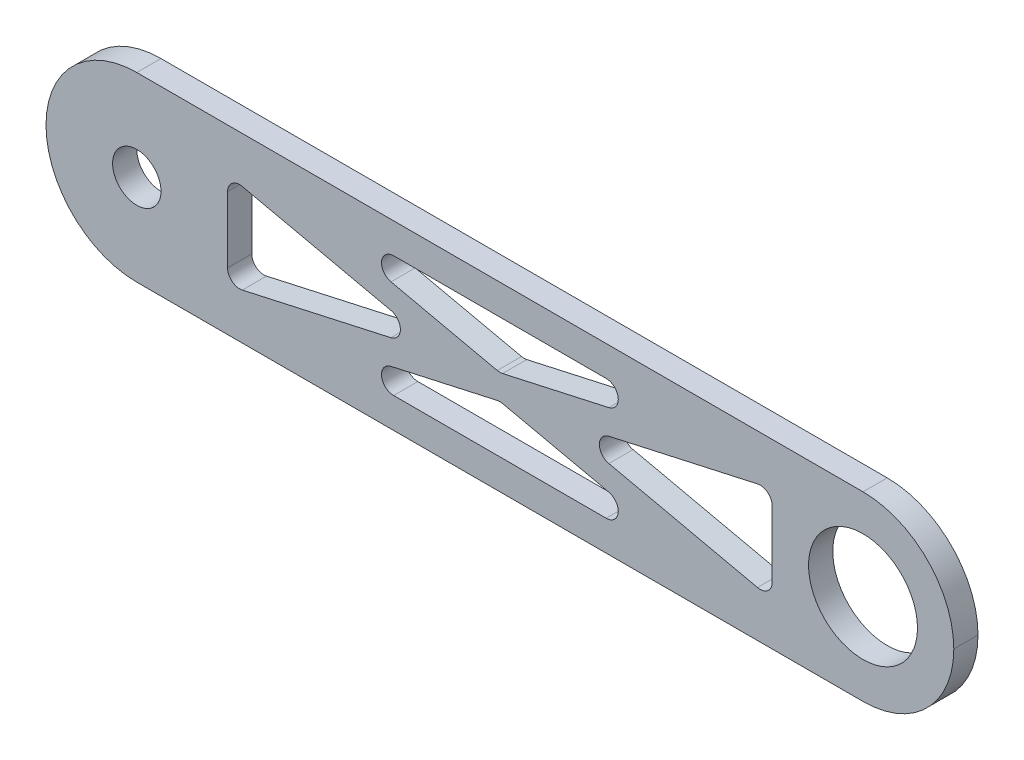
ISO-10303-21;
HEADER;
FILE_DESCRIPTION(('STEP AP214'),'2;1');
FILE_NAME('part.step','',(''),(''),'','','');
FILE_SCHEMA(('AUTOMOTIVE_DESIGN { 1 0 10303 214 1 1 1 1 }'));
ENDSEC;
DATA;
#1=APPLICATION_CONTEXT('core data for automotive mechanical design processes');
#2=APPLICATION_PROTOCOL_DEFINITION('international standard','automotive_design',2000,#1);
#3=PRODUCT_CONTEXT('',#1,'mechanical');
#4=PRODUCT('Part','Part','',(#3));
#5=PRODUCT_RELATED_PRODUCT_CATEGORY('part','',(#4));
#6=PRODUCT_DEFINITION_FORMATION('','',#4);
#7=PRODUCT_DEFINITION_CONTEXT('part definition',#1,'design');
#8=PRODUCT_DEFINITION('design','',#6,#7);
#9=PRODUCT_DEFINITION_SHAPE('','',#8);
#10=(LENGTH_UNIT() NAMED_UNIT(*) SI_UNIT(.MILLI.,.METRE.));
#11=(NAMED_UNIT(*) PLANE_ANGLE_UNIT() SI_UNIT($,.RADIAN.));
#12=(NAMED_UNIT(*) SI_UNIT($,.STERADIAN.) SOLID_ANGLE_UNIT());
#13=UNCERTAINTY_MEASURE_WITH_UNIT(LENGTH_MEASURE(1.E-05),#10,'distance_accuracy_value','');
#14=(GEOMETRIC_REPRESENTATION_CONTEXT(3) GLOBAL_UNCERTAINTY_ASSIGNED_CONTEXT((#13)) GLOBAL_UNIT_ASSIGNED_CONTEXT((#10,
#11,#12)) REPRESENTATION_CONTEXT('',''));
#15=CARTESIAN_POINT('',(0.,0.,0.));
#16=DIRECTION('',(0.,0.,1.));
#17=DIRECTION('',(1.,0.,0.));
#18=AXIS2_PLACEMENT_3D('',#15,#16,#17);
#19=CARTESIAN_POINT('',(-37.5,7.5,2.));
#20=DIRECTION('',(0.,-1.,0.));
#21=DIRECTION('',(0.,0.,-1.));
#22=AXIS2_PLACEMENT_3D('',#19,#20,#21);
#23=PLANE('',#22);
#24=DIRECTION('',(-1.,0.,0.));
#25=VECTOR('',#24,1.);
#26=CARTESIAN_POINT('',(-37.5,7.5,0.));
#27=LINE('',#26,#25);
#28=CARTESIAN_POINT('',(30.,7.5,0.));
#29=VERTEX_POINT('',#28);
#30=CARTESIAN_POINT('',(-30.,7.5,0.));
#31=VERTEX_POINT('',#30);
#32=EDGE_CURVE('E239',#29,#31,#27,.T.);
#33=ORIENTED_EDGE('',*,*,#32,.T.);
#34=DIRECTION('',(0.,0.,-1.));
#35=VECTOR('',#34,1.);
#36=CARTESIAN_POINT('',(-30.,7.5,2.));
#37=LINE('',#36,#35);
#38=CARTESIAN_POINT('',(-30.,7.5,2.));
#39=VERTEX_POINT('',#38);
#40=EDGE_CURVE('E276',#31,#39,#37,.F.);
#41=ORIENTED_EDGE('',*,*,#40,.T.);
#42=DIRECTION('',(-1.,0.,0.));
#43=VECTOR('',#42,1.);
#44=CARTESIAN_POINT('',(-37.5,7.5,2.));
#45=LINE('',#44,#43);
#46=CARTESIAN_POINT('',(30.,7.5,2.));
#47=VERTEX_POINT('',#46);
#48=EDGE_CURVE('E569',#47,#39,#45,.T.);
#49=ORIENTED_EDGE('',*,*,#48,.F.);
#50=DIRECTION('',(0.,0.,-1.));
#51=VECTOR('',#50,1.);
#52=CARTESIAN_POINT('',(30.,7.5,2.));
#53=LINE('',#52,#51);
#54=EDGE_CURVE('E274',#47,#29,#53,.T.);
#55=ORIENTED_EDGE('',*,*,#54,.T.);
#56=EDGE_LOOP('',(#33,#41,#49,#55));
#57=FACE_BOUND('',#56,.T.);
#58=ADVANCED_FACE('F34',(#57),#23,.F.);
#59=CARTESIAN_POINT('',(-37.5,-7.5,2.));
#60=DIRECTION('',(0.,1.,0.));
#61=DIRECTION('',(0.,0.,1.));
#62=AXIS2_PLACEMENT_3D('',#59,#60,#61);
#63=PLANE('',#62);
#64=DIRECTION('',(1.,0.,0.));
#65=VECTOR('',#64,1.);
#66=CARTESIAN_POINT('',(-37.5,-7.5,0.));
#67=LINE('',#66,#65);
#68=CARTESIAN_POINT('',(-30.,-7.5,0.));
#69=VERTEX_POINT('',#68);
#70=CARTESIAN_POINT('',(30.,-7.5,0.));
#71=VERTEX_POINT('',#70);
#72=EDGE_CURVE('E572',#69,#71,#67,.T.);
#73=ORIENTED_EDGE('',*,*,#72,.T.);
#74=DIRECTION('',(0.,0.,-1.));
#75=VECTOR('',#74,1.);
#76=CARTESIAN_POINT('',(30.,-7.5,2.));
#77=LINE('',#76,#75);
#78=CARTESIAN_POINT('',(30.,-7.5,2.));
#79=VERTEX_POINT('',#78);
#80=EDGE_CURVE('E255',#71,#79,#77,.F.);
#81=ORIENTED_EDGE('',*,*,#80,.T.);
#82=DIRECTION('',(1.,0.,0.));
#83=VECTOR('',#82,1.);
#84=CARTESIAN_POINT('',(-37.5,-7.5,2.));
#85=LINE('',#84,#83);
#86=CARTESIAN_POINT('',(-30.,-7.5,2.));
#87=VERTEX_POINT('',#86);
#88=EDGE_CURVE('E242',#87,#79,#85,.T.);
#89=ORIENTED_EDGE('',*,*,#88,.F.);
#90=DIRECTION('',(0.,0.,-1.));
#91=VECTOR('',#90,1.);
#92=CARTESIAN_POINT('',(-30.,-7.5,2.));
#93=LINE('',#92,#91);
#94=EDGE_CURVE('E263',#87,#69,#93,.T.);
#95=ORIENTED_EDGE('',*,*,#94,.T.);
#96=EDGE_LOOP('',(#73,#81,#89,#95));
#97=FACE_BOUND('',#96,.T.);
#98=ADVANCED_FACE('F439',(#97),#63,.F.);
#99=CARTESIAN_POINT('',(0.,0.,2.));
#100=DIRECTION('',(0.,0.,-1.));
#101=DIRECTION('',(-1.,0.,0.));
#102=AXIS2_PLACEMENT_3D('',#99,#100,#101);
#103=PLANE('',#102);
#104=DIRECTION('',(0.976187060183953,-0.216930457818656,0.));
#105=VECTOR('',#104,1.);
#106=CARTESIAN_POINT('',(4.60977222864645,0.,2.));
#107=LINE('',#106,#105);
#108=CARTESIAN_POINT('',(9.00261399947423,-0.976187060183952,2.));
#109=VERTEX_POINT('',#108);
#110=CARTESIAN_POINT('',(21.2830695421813,-3.70517718078553,2.));
#111=VERTEX_POINT('',#110);
#112=EDGE_CURVE('E535',#109,#111,#107,.T.);
#113=ORIENTED_EDGE('',*,*,#112,.F.);
#114=CARTESIAN_POINT('',(9.21954445729289,0.,2.));
#115=DIRECTION('',(0.,0.,-1.));
#116=DIRECTION('',(-1.,0.,0.));
#117=AXIS2_PLACEMENT_3D('',#114,#115,#116);
#118=CIRCLE('',#117,1.);
#119=CARTESIAN_POINT('',(9.00261399947423,0.976187060183954,2.));
#120=VERTEX_POINT('',#119);
#121=EDGE_CURVE('E56',#109,#120,#118,.T.);
#122=ORIENTED_EDGE('',*,*,#121,.T.);
#123=DIRECTION('',(-0.976187060183953,-0.216930457818656,0.));
#124=VECTOR('',#123,1.);
#125=CARTESIAN_POINT('',(4.60977222864645,0.,2.));
#126=LINE('',#125,#124);
#127=CARTESIAN_POINT('',(21.2830695421813,3.70517718078553,2.));
#128=VERTEX_POINT('',#127);
#129=EDGE_CURVE('E532',#128,#120,#126,.T.);
#130=ORIENTED_EDGE('',*,*,#129,.F.);
#131=CARTESIAN_POINT('',(21.5,2.72899012060158,2.));
#132=DIRECTION('',(0.,0.,-1.));
#133=DIRECTION('',(-1.,0.,0.));
#134=AXIS2_PLACEMENT_3D('',#131,#132,#133);
#135=CIRCLE('',#134,1.);
#136=CARTESIAN_POINT('',(22.5,2.72899012060158,2.));
#137=VERTEX_POINT('',#136);
#138=EDGE_CURVE('E412',#128,#137,#135,.T.);
#139=ORIENTED_EDGE('',*,*,#138,.T.);
#140=DIRECTION('',(0.,1.,0.));
#141=VECTOR('',#140,1.);
#142=CARTESIAN_POINT('',(22.5,-3.9756061714119,2.));
#143=LINE('',#142,#141);
#144=CARTESIAN_POINT('',(22.5,-2.72899012060158,2.));
#145=VERTEX_POINT('',#144);
#146=EDGE_CURVE('E537',#145,#137,#143,.T.);
#147=ORIENTED_EDGE('',*,*,#146,.F.);
#148=CARTESIAN_POINT('',(21.5,-2.72899012060158,2.));
#149=DIRECTION('',(0.,0.,-1.));
#150=DIRECTION('',(-1.,0.,0.));
#151=AXIS2_PLACEMENT_3D('',#148,#149,#150);
#152=CIRCLE('',#151,1.);
#153=EDGE_CURVE('E42',#145,#111,#152,.T.);
#154=ORIENTED_EDGE('',*,*,#153,.T.);
#155=EDGE_LOOP('',(#113,#122,#130,#139,#147,#154));
#156=FACE_BOUND('',#155,.T.);
#157=DIRECTION('',(-0.976187060183953,-0.216930457818656,0.));
#158=VECTOR('',#157,1.);
#159=CARTESIAN_POINT('',(-17.8902277713536,-5.,2.));
#160=LINE('',#159,#158);
#161=CARTESIAN_POINT('',(-0.216930457818641,-1.07260059699224,2.));
#162=VERTEX_POINT('',#161);
#163=CARTESIAN_POINT('',(-8.99738600052576,-3.02381293981605,2.));
#164=VERTEX_POINT('',#163);
#165=EDGE_CURVE('E511',#162,#164,#160,.T.);
#166=ORIENTED_EDGE('',*,*,#165,.F.);
#167=CARTESIAN_POINT('',(0.,-2.0487876571762,2.));
#168=DIRECTION('',(0.,0.,-1.));
#169=DIRECTION('',(-1.,0.,0.));
#170=AXIS2_PLACEMENT_3D('',#167,#168,#169);
#171=CIRCLE('',#170,1.);
#172=CARTESIAN_POINT('',(0.216930457818666,-1.07260059699225,2.));
#173=VERTEX_POINT('',#172);
#174=EDGE_CURVE('E408',#162,#173,#171,.T.);
#175=ORIENTED_EDGE('',*,*,#174,.T.);
#176=DIRECTION('',(-0.976187060183953,0.216930457818656,0.));
#177=VECTOR('',#176,1.);
#178=CARTESIAN_POINT('',(0.,-1.0243938285881,2.));
#179=LINE('',#178,#177);
#180=CARTESIAN_POINT('',(8.99738600052576,-3.02381293981605,2.));
#181=VERTEX_POINT('',#180);
#182=EDGE_CURVE('E526',#181,#173,#179,.T.);
#183=ORIENTED_EDGE('',*,*,#182,.F.);
#184=CARTESIAN_POINT('',(8.78045554270711,-4.,2.));
#185=DIRECTION('',(0.,0.,-1.));
#186=DIRECTION('',(-1.,0.,0.));
#187=AXIS2_PLACEMENT_3D('',#184,#185,#186);
#188=CIRCLE('',#187,1.);
#189=CARTESIAN_POINT('',(8.78045554270711,-5.,2.));
#190=VERTEX_POINT('',#189);
#191=EDGE_CURVE('E400',#181,#190,#188,.T.);
#192=ORIENTED_EDGE('',*,*,#191,.T.);
#193=DIRECTION('',(1.,0.,0.));
#194=VECTOR('',#193,1.);
#195=CARTESIAN_POINT('',(-17.8902277713536,-5.,2.));
#196=LINE('',#195,#194);
#197=CARTESIAN_POINT('',(-8.7804555427071,-5.,2.));
#198=VERTEX_POINT('',#197);
#199=EDGE_CURVE('E520',#198,#190,#196,.T.);
#200=ORIENTED_EDGE('',*,*,#199,.F.);
#201=CARTESIAN_POINT('',(-8.7804555427071,-4.,2.));
#202=DIRECTION('',(0.,0.,-1.));
#203=DIRECTION('',(-1.,0.,0.));
#204=AXIS2_PLACEMENT_3D('',#201,#202,#203);
#205=CIRCLE('',#204,1.);
#206=EDGE_CURVE('E404',#198,#164,#205,.T.);
#207=ORIENTED_EDGE('',*,*,#206,.T.);
#208=EDGE_LOOP('',(#166,#175,#183,#192,#200,#207));
#209=FACE_BOUND('',#208,.T.);
#210=DIRECTION('',(0.,-1.,0.));
#211=VECTOR('',#210,1.);
#212=CARTESIAN_POINT('',(-22.5,-3.9756061714119,2.));
#213=LINE('',#212,#211);
#214=CARTESIAN_POINT('',(-22.5,2.72899012060158,2.));
#215=VERTEX_POINT('',#214);
#216=CARTESIAN_POINT('',(-22.5,-2.72899012060158,2.));
#217=VERTEX_POINT('',#216);
#218=EDGE_CURVE('E543',#215,#217,#213,.T.);
#219=ORIENTED_EDGE('',*,*,#218,.F.);
#220=CARTESIAN_POINT('',(-21.5,2.72899012060158,2.));
#221=DIRECTION('',(0.,0.,-1.));
#222=DIRECTION('',(-1.,0.,0.));
#223=AXIS2_PLACEMENT_3D('',#220,#221,#222);
#224=CIRCLE('',#223,1.);
#225=CARTESIAN_POINT('',(-21.2830695421813,3.70517718078553,2.));
#226=VERTEX_POINT('',#225);
#227=EDGE_CURVE('E396',#215,#226,#224,.T.);
#228=ORIENTED_EDGE('',*,*,#227,.T.);
#229=DIRECTION('',(-0.976187060183953,0.216930457818656,0.));
#230=VECTOR('',#229,1.);
#231=CARTESIAN_POINT('',(-22.5,3.9756061714119,2.));
#232=LINE('',#231,#230);
#233=CARTESIAN_POINT('',(-9.00261399947423,0.976187060183953,2.));
#234=VERTEX_POINT('',#233);
#235=EDGE_CURVE('E540',#234,#226,#232,.T.);
#236=ORIENTED_EDGE('',*,*,#235,.F.);
#237=CARTESIAN_POINT('',(-9.21954445729288,0.,2.));
#238=DIRECTION('',(0.,0.,-1.));
#239=DIRECTION('',(-1.,0.,0.));
#240=AXIS2_PLACEMENT_3D('',#237,#238,#239);
#241=CIRCLE('',#240,1.);
#242=CARTESIAN_POINT('',(-9.00261399947423,-0.976187060183954,2.));
#243=VERTEX_POINT('',#242);
#244=EDGE_CURVE('E388',#234,#243,#241,.T.);
#245=ORIENTED_EDGE('',*,*,#244,.T.);
#246=DIRECTION('',(0.976187060183953,0.216930457818656,0.));
#247=VECTOR('',#246,1.);
#248=CARTESIAN_POINT('',(-22.5,-3.9756061714119,2.));
#249=LINE('',#248,#247);
#250=CARTESIAN_POINT('',(-21.2830695421813,-3.70517718078553,2.));
#251=VERTEX_POINT('',#250);
#252=EDGE_CURVE('E546',#251,#243,#249,.T.);
#253=ORIENTED_EDGE('',*,*,#252,.F.);
#254=CARTESIAN_POINT('',(-21.5,-2.72899012060158,2.));
#255=DIRECTION('',(0.,0.,-1.));
#256=DIRECTION('',(-1.,0.,0.));
#257=AXIS2_PLACEMENT_3D('',#254,#255,#256);
#258=CIRCLE('',#257,1.);
#259=EDGE_CURVE('E392',#251,#217,#258,.T.);
#260=ORIENTED_EDGE('',*,*,#259,.T.);
#261=EDGE_LOOP('',(#219,#228,#236,#245,#253,#260));
#262=FACE_BOUND('',#261,.T.);
#263=DIRECTION('',(0.976187060183953,0.216930457818656,0.));
#264=VECTOR('',#263,1.);
#265=CARTESIAN_POINT('',(0.,1.0243938285881,2.));
#266=LINE('',#265,#264);
#267=CARTESIAN_POINT('',(0.21693045781866,1.07260059699225,2.));
#268=VERTEX_POINT('',#267);
#269=CARTESIAN_POINT('',(8.99738600052576,3.02381293981605,2.));
#270=VERTEX_POINT('',#269);
#271=EDGE_CURVE('E552',#268,#270,#266,.T.);
#272=ORIENTED_EDGE('',*,*,#271,.F.);
#273=CARTESIAN_POINT('',(0.,2.0487876571762,2.));
#274=DIRECTION('',(0.,0.,-1.));
#275=DIRECTION('',(-1.,0.,0.));
#276=AXIS2_PLACEMENT_3D('',#273,#274,#275);
#277=CIRCLE('',#276,1.);
#278=CARTESIAN_POINT('',(-0.216930457818648,1.07260059699224,2.));
#279=VERTEX_POINT('',#278);
#280=EDGE_CURVE('E384',#268,#279,#277,.T.);
#281=ORIENTED_EDGE('',*,*,#280,.T.);
#282=DIRECTION('',(0.976187060183953,-0.216930457818656,0.));
#283=VECTOR('',#282,1.);
#284=CARTESIAN_POINT('',(-17.8902277713536,5.,2.));
#285=LINE('',#284,#283);
#286=CARTESIAN_POINT('',(-8.99738600052576,3.02381293981605,2.));
#287=VERTEX_POINT('',#286);
#288=EDGE_CURVE('E549',#287,#279,#285,.T.);
#289=ORIENTED_EDGE('',*,*,#288,.F.);
#290=CARTESIAN_POINT('',(-8.7804555427071,4.,2.));
#291=DIRECTION('',(0.,0.,-1.));
#292=DIRECTION('',(-1.,0.,0.));
#293=AXIS2_PLACEMENT_3D('',#290,#291,#292);
#294=CIRCLE('',#293,1.);
#295=CARTESIAN_POINT('',(-8.7804555427071,5.,2.));
#296=VERTEX_POINT('',#295);
#297=EDGE_CURVE('E376',#287,#296,#294,.T.);
#298=ORIENTED_EDGE('',*,*,#297,.T.);
#299=DIRECTION('',(-1.,0.,0.));
#300=VECTOR('',#299,1.);
#301=CARTESIAN_POINT('',(-17.8902277713536,5.,2.));
#302=LINE('',#301,#300);
#303=CARTESIAN_POINT('',(8.7804555427071,5.,2.));
#304=VERTEX_POINT('',#303);
#305=EDGE_CURVE('E555',#304,#296,#302,.T.);
#306=ORIENTED_EDGE('',*,*,#305,.F.);
#307=CARTESIAN_POINT('',(8.7804555427071,4.,2.));
#308=DIRECTION('',(0.,0.,-1.));
#309=DIRECTION('',(-1.,0.,0.));
#310=AXIS2_PLACEMENT_3D('',#307,#308,#309);
#311=CIRCLE('',#310,1.);
#312=EDGE_CURVE('E380',#304,#270,#311,.T.);
#313=ORIENTED_EDGE('',*,*,#312,.T.);
#314=EDGE_LOOP('',(#272,#281,#289,#298,#306,#313));
#315=FACE_BOUND('',#314,.T.);
#316=CARTESIAN_POINT('',(-30.,0.,2.));
#317=DIRECTION('',(0.,0.,1.));
#318=DIRECTION('',(1.,0.,0.));
#319=AXIS2_PLACEMENT_3D('',#316,#317,#318);
#320=CIRCLE('',#319,2.);
#321=CARTESIAN_POINT('',(-28.,0.,2.));
#322=VERTEX_POINT('',#321);
#323=EDGE_CURVE('E558',#322,#322,#320,.T.);
#324=ORIENTED_EDGE('',*,*,#323,.F.);
#325=EDGE_LOOP('',(#324));
#326=FACE_BOUND('',#325,.T.);
#327=CARTESIAN_POINT('',(30.,0.,2.));
#328=DIRECTION('',(0.,0.,1.));
#329=DIRECTION('',(1.,0.,0.));
#330=AXIS2_PLACEMENT_3D('',#327,#328,#329);
#331=CIRCLE('',#330,4.5);
#332=CARTESIAN_POINT('',(34.5,0.,2.));
#333=VERTEX_POINT('',#332);
#334=EDGE_CURVE('E562',#333,#333,#331,.T.);
#335=ORIENTED_EDGE('',*,*,#334,.F.);
#336=EDGE_LOOP('',(#335));
#337=FACE_BOUND('',#336,.T.);
#338=CARTESIAN_POINT('',(-30.,0.,2.));
#339=DIRECTION('',(0.,0.,-1.));
#340=DIRECTION('',(-1.,0.,0.));
#341=AXIS2_PLACEMENT_3D('',#338,#339,#340);
#342=CIRCLE('',#341,7.5);
#343=CARTESIAN_POINT('',(-37.5,0.,2.));
#344=VERTEX_POINT('',#343);
#345=EDGE_CURVE('E270',#39,#344,#342,.F.);
#346=ORIENTED_EDGE('',*,*,#345,.T.);
#347=CARTESIAN_POINT('',(-30.,0.,2.));
#348=DIRECTION('',(0.,0.,-1.));
#349=DIRECTION('',(-1.,0.,0.));
#350=AXIS2_PLACEMENT_3D('',#347,#348,#349);
#351=CIRCLE('',#350,7.5);
#352=EDGE_CURVE('E272',#344,#87,#351,.F.);
#353=ORIENTED_EDGE('',*,*,#352,.T.);
#354=ORIENTED_EDGE('',*,*,#88,.T.);
#355=CARTESIAN_POINT('',(30.,0.,2.));
#356=DIRECTION('',(0.,0.,-1.));
#357=DIRECTION('',(-1.,0.,0.));
#358=AXIS2_PLACEMENT_3D('',#355,#356,#357);
#359=CIRCLE('',#358,7.5);
#360=CARTESIAN_POINT('',(37.5,0.,2.));
#361=VERTEX_POINT('',#360);
#362=EDGE_CURVE('E268',#79,#361,#359,.F.);
#363=ORIENTED_EDGE('',*,*,#362,.T.);
#364=CARTESIAN_POINT('',(30.,0.,2.));
#365=DIRECTION('',(0.,0.,-1.));
#366=DIRECTION('',(-1.,0.,0.));
#367=AXIS2_PLACEMENT_3D('',#364,#365,#366);
#368=CIRCLE('',#367,7.5);
#369=EDGE_CURVE('E248',#361,#47,#368,.F.);
#370=ORIENTED_EDGE('',*,*,#369,.T.);
#371=ORIENTED_EDGE('',*,*,#48,.T.);
#372=EDGE_LOOP('',(#346,#353,#354,#363,#370,#371));
#373=FACE_BOUND('',#372,.T.);
#374=ADVANCED_FACE('F445',(#156,#209,#262,#315,#326,#337,#373),#103,.F.);
#375=CARTESIAN_POINT('',(0.,0.,0.));
#376=DIRECTION('',(0.,0.,-1.));
#377=DIRECTION('',(-1.,0.,0.));
#378=AXIS2_PLACEMENT_3D('',#375,#376,#377);
#379=PLANE('',#378);
#380=DIRECTION('',(0.976187060183953,0.216930457818656,0.));
#381=VECTOR('',#380,1.);
#382=CARTESIAN_POINT('',(0.216930457818657,-0.976187060183954,0.));
#383=LINE('',#382,#381);
#384=CARTESIAN_POINT('',(9.00261399947424,0.976187060183954,0.));
#385=VERTEX_POINT('',#384);
#386=CARTESIAN_POINT('',(21.2830695421813,3.70517718078554,0.));
#387=VERTEX_POINT('',#386);
#388=EDGE_CURVE('E314',#385,#387,#383,.T.);
#389=ORIENTED_EDGE('',*,*,#388,.F.);
#390=CARTESIAN_POINT('',(9.21954445729289,0.,0.));
#391=DIRECTION('',(0.,0.,-1.));
#392=DIRECTION('',(-1.,0.,0.));
#393=AXIS2_PLACEMENT_3D('',#390,#391,#392);
#394=CIRCLE('',#393,1.);
#395=CARTESIAN_POINT('',(9.00261399947424,-0.976187060183952,0.));
#396=VERTEX_POINT('',#395);
#397=EDGE_CURVE('E417',#385,#396,#394,.F.);
#398=ORIENTED_EDGE('',*,*,#397,.T.);
#399=DIRECTION('',(-0.976187060183953,0.216930457818656,0.));
#400=VECTOR('',#399,1.);
#401=CARTESIAN_POINT('',(0.216930457818657,0.976187060183956,0.));
#402=LINE('',#401,#400);
#403=CARTESIAN_POINT('',(21.2830695421813,-3.70517718078553,0.));
#404=VERTEX_POINT('',#403);
#405=EDGE_CURVE('E308',#404,#396,#402,.T.);
#406=ORIENTED_EDGE('',*,*,#405,.F.);
#407=CARTESIAN_POINT('',(21.5,-2.72899012060158,0.));
#408=DIRECTION('',(0.,0.,-1.));
#409=DIRECTION('',(-1.,0.,0.));
#410=AXIS2_PLACEMENT_3D('',#407,#408,#409);
#411=CIRCLE('',#410,1.);
#412=CARTESIAN_POINT('',(22.5,-2.72899012060158,0.));
#413=VERTEX_POINT('',#412);
#414=EDGE_CURVE('E11',#404,#413,#411,.F.);
#415=ORIENTED_EDGE('',*,*,#414,.T.);
#416=DIRECTION('',(0.,-1.,0.));
#417=VECTOR('',#416,1.);
#418=CARTESIAN_POINT('',(22.5,0.,0.));
#419=LINE('',#418,#417);
#420=CARTESIAN_POINT('',(22.5,2.72899012060158,0.));
#421=VERTEX_POINT('',#420);
#422=EDGE_CURVE('E311',#421,#413,#419,.T.);
#423=ORIENTED_EDGE('',*,*,#422,.F.);
#424=CARTESIAN_POINT('',(21.5,2.72899012060158,0.));
#425=DIRECTION('',(0.,0.,-1.));
#426=DIRECTION('',(-1.,0.,0.));
#427=AXIS2_PLACEMENT_3D('',#424,#425,#426);
#428=CIRCLE('',#427,1.);
#429=EDGE_CURVE('E414',#421,#387,#428,.F.);
#430=ORIENTED_EDGE('',*,*,#429,.T.);
#431=EDGE_LOOP('',(#389,#398,#406,#415,#423,#430));
#432=FACE_BOUND('',#431,.T.);
#433=DIRECTION('',(0.976187060183953,-0.216930457818656,0.));
#434=VECTOR('',#433,1.);
#435=CARTESIAN_POINT('',(-0.216930457818656,-0.976187060183952,0.));
#436=LINE('',#435,#434);
#437=CARTESIAN_POINT('',(0.216930457818667,-1.07260059699225,0.));
#438=VERTEX_POINT('',#437);
#439=CARTESIAN_POINT('',(8.99738600052577,-3.02381293981605,0.));
#440=VERTEX_POINT('',#439);
#441=EDGE_CURVE('E305',#438,#440,#436,.T.);
#442=ORIENTED_EDGE('',*,*,#441,.F.);
#443=CARTESIAN_POINT('',(0.,-2.0487876571762,0.));
#444=DIRECTION('',(0.,0.,-1.));
#445=DIRECTION('',(-1.,0.,0.));
#446=AXIS2_PLACEMENT_3D('',#443,#444,#445);
#447=CIRCLE('',#446,1.);
#448=CARTESIAN_POINT('',(-0.216930457818646,-1.07260059699224,0.));
#449=VERTEX_POINT('',#448);
#450=EDGE_CURVE('E410',#438,#449,#447,.F.);
#451=ORIENTED_EDGE('',*,*,#450,.T.);
#452=DIRECTION('',(0.976187060183953,0.216930457818656,0.));
#453=VECTOR('',#452,1.);
#454=CARTESIAN_POINT('',(0.216930457818657,-0.976187060183955,0.));
#455=LINE('',#454,#453);
#456=CARTESIAN_POINT('',(-8.99738600052576,-3.02381293981605,0.));
#457=VERTEX_POINT('',#456);
#458=EDGE_CURVE('E299',#457,#449,#455,.T.);
#459=ORIENTED_EDGE('',*,*,#458,.F.);
#460=CARTESIAN_POINT('',(-8.7804555427071,-4.,0.));
#461=DIRECTION('',(0.,0.,-1.));
#462=DIRECTION('',(-1.,0.,0.));
#463=AXIS2_PLACEMENT_3D('',#460,#461,#462);
#464=CIRCLE('',#463,1.);
#465=CARTESIAN_POINT('',(-8.7804555427071,-5.,0.));
#466=VERTEX_POINT('',#465);
#467=EDGE_CURVE('E406',#457,#466,#464,.F.);
#468=ORIENTED_EDGE('',*,*,#467,.T.);
#469=DIRECTION('',(-1.,0.,0.));
#470=VECTOR('',#469,1.);
#471=CARTESIAN_POINT('',(0.,-5.,0.));
#472=LINE('',#471,#470);
#473=CARTESIAN_POINT('',(8.78045554270711,-5.,0.));
#474=VERTEX_POINT('',#473);
#475=EDGE_CURVE('E302',#474,#466,#472,.T.);
#476=ORIENTED_EDGE('',*,*,#475,.F.);
#477=CARTESIAN_POINT('',(8.78045554270711,-4.,0.));
#478=DIRECTION('',(0.,0.,-1.));
#479=DIRECTION('',(-1.,0.,0.));
#480=AXIS2_PLACEMENT_3D('',#477,#478,#479);
#481=CIRCLE('',#480,1.);
#482=EDGE_CURVE('E402',#474,#440,#481,.F.);
#483=ORIENTED_EDGE('',*,*,#482,.T.);
#484=EDGE_LOOP('',(#442,#451,#459,#468,#476,#483));
#485=FACE_BOUND('',#484,.T.);
#486=DIRECTION('',(0.976187060183953,-0.216930457818656,0.));
#487=VECTOR('',#486,1.);
#488=CARTESIAN_POINT('',(-0.216930457818656,-0.976187060183954,0.));
#489=LINE('',#488,#487);
#490=CARTESIAN_POINT('',(-21.2830695421813,3.70517718078553,0.));
#491=VERTEX_POINT('',#490);
#492=CARTESIAN_POINT('',(-9.00261399947423,0.976187060183952,0.));
#493=VERTEX_POINT('',#492);
#494=EDGE_CURVE('E296',#491,#493,#489,.T.);
#495=ORIENTED_EDGE('',*,*,#494,.F.);
#496=CARTESIAN_POINT('',(-21.5,2.72899012060158,0.));
#497=DIRECTION('',(0.,0.,-1.));
#498=DIRECTION('',(-1.,0.,0.));
#499=AXIS2_PLACEMENT_3D('',#496,#497,#498);
#500=CIRCLE('',#499,1.);
#501=CARTESIAN_POINT('',(-22.5,2.72899012060158,0.));
#502=VERTEX_POINT('',#501);
#503=EDGE_CURVE('E398',#491,#502,#500,.F.);
#504=ORIENTED_EDGE('',*,*,#503,.T.);
#505=DIRECTION('',(0.,1.,0.));
#506=VECTOR('',#505,1.);
#507=CARTESIAN_POINT('',(-22.5,0.,0.));
#508=LINE('',#507,#506);
#509=CARTESIAN_POINT('',(-22.5,-2.72899012060158,0.));
#510=VERTEX_POINT('',#509);
#511=EDGE_CURVE('E290',#510,#502,#508,.T.);
#512=ORIENTED_EDGE('',*,*,#511,.F.);
#513=CARTESIAN_POINT('',(-21.5,-2.72899012060158,0.));
#514=DIRECTION('',(0.,0.,-1.));
#515=DIRECTION('',(-1.,0.,0.));
#516=AXIS2_PLACEMENT_3D('',#513,#514,#515);
#517=CIRCLE('',#516,1.);
#518=CARTESIAN_POINT('',(-21.2830695421813,-3.70517718078553,0.));
#519=VERTEX_POINT('',#518);
#520=EDGE_CURVE('E394',#510,#519,#517,.F.);
#521=ORIENTED_EDGE('',*,*,#520,.T.);
#522=DIRECTION('',(-0.976187060183953,-0.216930457818656,0.));
#523=VECTOR('',#522,1.);
#524=CARTESIAN_POINT('',(-0.216930457818656,0.976187060183952,0.));
#525=LINE('',#524,#523);
#526=CARTESIAN_POINT('',(-9.00261399947423,-0.976187060183954,0.));
#527=VERTEX_POINT('',#526);
#528=EDGE_CURVE('E293',#527,#519,#525,.T.);
#529=ORIENTED_EDGE('',*,*,#528,.F.);
#530=CARTESIAN_POINT('',(-9.21954445729288,0.,0.));
#531=DIRECTION('',(0.,0.,-1.));
#532=DIRECTION('',(-1.,0.,0.));
#533=AXIS2_PLACEMENT_3D('',#530,#531,#532);
#534=CIRCLE('',#533,1.);
#535=EDGE_CURVE('E390',#527,#493,#534,.F.);
#536=ORIENTED_EDGE('',*,*,#535,.T.);
#537=EDGE_LOOP('',(#495,#504,#512,#521,#529,#536));
#538=FACE_BOUND('',#537,.T.);
#539=DIRECTION('',(-0.976187060183953,0.216930457818656,0.));
#540=VECTOR('',#539,1.);
#541=CARTESIAN_POINT('',(0.216930457818657,0.976187060183955,0.));
#542=LINE('',#541,#540);
#543=CARTESIAN_POINT('',(-0.216930457818652,1.07260059699225,0.));
#544=VERTEX_POINT('',#543);
#545=CARTESIAN_POINT('',(-8.99738600052576,3.02381293981605,0.));
#546=VERTEX_POINT('',#545);
#547=EDGE_CURVE('E287',#544,#546,#542,.T.);
#548=ORIENTED_EDGE('',*,*,#547,.F.);
#549=CARTESIAN_POINT('',(0.,2.0487876571762,0.));
#550=DIRECTION('',(0.,0.,-1.));
#551=DIRECTION('',(-1.,0.,0.));
#552=AXIS2_PLACEMENT_3D('',#549,#550,#551);
#553=CIRCLE('',#552,1.);
#554=CARTESIAN_POINT('',(0.21693045781866,1.07260059699225,0.));
#555=VERTEX_POINT('',#554);
#556=EDGE_CURVE('E386',#544,#555,#553,.F.);
#557=ORIENTED_EDGE('',*,*,#556,.T.);
#558=DIRECTION('',(-0.976187060183953,-0.216930457818656,0.));
#559=VECTOR('',#558,1.);
#560=CARTESIAN_POINT('',(-0.216930457818656,0.976187060183954,0.));
#561=LINE('',#560,#559);
#562=CARTESIAN_POINT('',(8.99738600052576,3.02381293981605,0.));
#563=VERTEX_POINT('',#562);
#564=EDGE_CURVE('E277',#563,#555,#561,.T.);
#565=ORIENTED_EDGE('',*,*,#564,.F.);
#566=CARTESIAN_POINT('',(8.7804555427071,4.,0.));
#567=DIRECTION('',(0.,0.,-1.));
#568=DIRECTION('',(-1.,0.,0.));
#569=AXIS2_PLACEMENT_3D('',#566,#567,#568);
#570=CIRCLE('',#569,1.);
#571=CARTESIAN_POINT('',(8.7804555427071,5.,0.));
#572=VERTEX_POINT('',#571);
#573=EDGE_CURVE('E382',#563,#572,#570,.F.);
#574=ORIENTED_EDGE('',*,*,#573,.T.);
#575=DIRECTION('',(1.,0.,0.));
#576=VECTOR('',#575,1.);
#577=CARTESIAN_POINT('',(0.,5.,0.));
#578=LINE('',#577,#576);
#579=CARTESIAN_POINT('',(-8.7804555427071,5.,0.));
#580=VERTEX_POINT('',#579);
#581=EDGE_CURVE('E284',#580,#572,#578,.T.);
#582=ORIENTED_EDGE('',*,*,#581,.F.);
#583=CARTESIAN_POINT('',(-8.7804555427071,4.,0.));
#584=DIRECTION('',(0.,0.,-1.));
#585=DIRECTION('',(-1.,0.,0.));
#586=AXIS2_PLACEMENT_3D('',#583,#584,#585);
#587=CIRCLE('',#586,1.);
#588=EDGE_CURVE('E378',#580,#546,#587,.F.);
#589=ORIENTED_EDGE('',*,*,#588,.T.);
#590=EDGE_LOOP('',(#548,#557,#565,#574,#582,#589));
#591=FACE_BOUND('',#590,.T.);
#592=CARTESIAN_POINT('',(-30.,0.,0.));
#593=DIRECTION('',(0.,0.,1.));
#594=DIRECTION('',(1.,0.,0.));
#595=AXIS2_PLACEMENT_3D('',#592,#593,#594);
#596=CIRCLE('',#595,2.);
#597=CARTESIAN_POINT('',(-28.,0.,0.));
#598=VERTEX_POINT('',#597);
#599=EDGE_CURVE('E559',#598,#598,#596,.T.);
#600=ORIENTED_EDGE('',*,*,#599,.T.);
#601=EDGE_LOOP('',(#600));
#602=FACE_BOUND('',#601,.T.);
#603=CARTESIAN_POINT('',(30.,0.,0.));
#604=DIRECTION('',(0.,0.,1.));
#605=DIRECTION('',(1.,0.,0.));
#606=AXIS2_PLACEMENT_3D('',#603,#604,#605);
#607=CIRCLE('',#606,4.5);
#608=CARTESIAN_POINT('',(34.5,0.,0.));
#609=VERTEX_POINT('',#608);
#610=EDGE_CURVE('E281',#609,#609,#607,.T.);
#611=ORIENTED_EDGE('',*,*,#610,.T.);
#612=EDGE_LOOP('',(#611));
#613=FACE_BOUND('',#612,.T.);
#614=ORIENTED_EDGE('',*,*,#72,.F.);
#615=CARTESIAN_POINT('',(-30.,0.,0.));
#616=DIRECTION('',(0.,0.,-1.));
#617=DIRECTION('',(-1.,0.,0.));
#618=AXIS2_PLACEMENT_3D('',#615,#616,#617);
#619=CIRCLE('',#618,7.5);
#620=CARTESIAN_POINT('',(-37.5,0.,0.));
#621=VERTEX_POINT('',#620);
#622=EDGE_CURVE('E258',#69,#621,#619,.T.);
#623=ORIENTED_EDGE('',*,*,#622,.T.);
#624=CARTESIAN_POINT('',(-30.,0.,0.));
#625=DIRECTION('',(0.,0.,-1.));
#626=DIRECTION('',(-1.,0.,0.));
#627=AXIS2_PLACEMENT_3D('',#624,#625,#626);
#628=CIRCLE('',#627,7.5);
#629=EDGE_CURVE('E256',#621,#31,#628,.T.);
#630=ORIENTED_EDGE('',*,*,#629,.T.);
#631=ORIENTED_EDGE('',*,*,#32,.F.);
#632=CARTESIAN_POINT('',(30.,0.,0.));
#633=DIRECTION('',(0.,0.,-1.));
#634=DIRECTION('',(-1.,0.,0.));
#635=AXIS2_PLACEMENT_3D('',#632,#633,#634);
#636=CIRCLE('',#635,7.5);
#637=CARTESIAN_POINT('',(37.5,0.,0.));
#638=VERTEX_POINT('',#637);
#639=EDGE_CURVE('E231',#29,#638,#636,.T.);
#640=ORIENTED_EDGE('',*,*,#639,.T.);
#641=CARTESIAN_POINT('',(30.,0.,0.));
#642=DIRECTION('',(0.,0.,-1.));
#643=DIRECTION('',(-1.,0.,0.));
#644=AXIS2_PLACEMENT_3D('',#641,#642,#643);
#645=CIRCLE('',#644,7.5);
#646=EDGE_CURVE('E236',#638,#71,#645,.T.);
#647=ORIENTED_EDGE('',*,*,#646,.T.);
#648=EDGE_LOOP('',(#614,#623,#630,#631,#640,#647));
#649=FACE_BOUND('',#648,.T.);
#650=ADVANCED_FACE('F234',(#432,#485,#538,#591,#602,#613,#649),#379,.T.);
#651=CARTESIAN_POINT('',(30.,0.,2.));
#652=DIRECTION('',(0.,0.,-1.));
#653=DIRECTION('',(-1.,0.,0.));
#654=AXIS2_PLACEMENT_3D('',#651,#652,#653);
#655=CYLINDRICAL_SURFACE('',#654,7.5);
#656=ORIENTED_EDGE('',*,*,#54,.F.);
#657=ORIENTED_EDGE('',*,*,#369,.F.);
#658=DIRECTION('',(0.,0.,-1.));
#659=VECTOR('',#658,1.);
#660=CARTESIAN_POINT('',(37.5,0.,2.));
#661=LINE('',#660,#659);
#662=EDGE_CURVE('E246',#638,#361,#661,.F.);
#663=ORIENTED_EDGE('',*,*,#662,.F.);
#664=ORIENTED_EDGE('',*,*,#639,.F.);
#665=EDGE_LOOP('',(#656,#657,#663,#664));
#666=FACE_BOUND('',#665,.T.);
#667=ADVANCED_FACE('F247',(#666),#655,.T.);
#668=CARTESIAN_POINT('',(30.,0.,2.));
#669=DIRECTION('',(0.,0.,-1.));
#670=DIRECTION('',(-1.,0.,0.));
#671=AXIS2_PLACEMENT_3D('',#668,#669,#670);
#672=CYLINDRICAL_SURFACE('',#671,7.5);
#673=ORIENTED_EDGE('',*,*,#362,.F.);
#674=ORIENTED_EDGE('',*,*,#80,.F.);
#675=ORIENTED_EDGE('',*,*,#646,.F.);
#676=ORIENTED_EDGE('',*,*,#662,.T.);
#677=EDGE_LOOP('',(#673,#674,#675,#676));
#678=FACE_BOUND('',#677,.T.);
#679=ADVANCED_FACE('F253',(#678),#672,.T.);
#680=CARTESIAN_POINT('',(-30.,0.,2.));
#681=DIRECTION('',(0.,0.,-1.));
#682=DIRECTION('',(-1.,0.,0.));
#683=AXIS2_PLACEMENT_3D('',#680,#681,#682);
#684=CYLINDRICAL_SURFACE('',#683,7.5);
#685=DIRECTION('',(0.,0.,-1.));
#686=VECTOR('',#685,1.);
#687=CARTESIAN_POINT('',(-37.5,0.,2.));
#688=LINE('',#687,#686);
#689=EDGE_CURVE('E250',#344,#621,#688,.T.);
#690=ORIENTED_EDGE('',*,*,#689,.F.);
#691=ORIENTED_EDGE('',*,*,#345,.F.);
#692=ORIENTED_EDGE('',*,*,#40,.F.);
#693=ORIENTED_EDGE('',*,*,#629,.F.);
#694=EDGE_LOOP('',(#690,#691,#692,#693));
#695=FACE_BOUND('',#694,.T.);
#696=ADVANCED_FACE('F452',(#695),#684,.T.);
#697=CARTESIAN_POINT('',(-30.,0.,2.));
#698=DIRECTION('',(0.,0.,-1.));
#699=DIRECTION('',(-1.,0.,0.));
#700=AXIS2_PLACEMENT_3D('',#697,#698,#699);
#701=CYLINDRICAL_SURFACE('',#700,7.5);
#702=ORIENTED_EDGE('',*,*,#352,.F.);
#703=ORIENTED_EDGE('',*,*,#689,.T.);
#704=ORIENTED_EDGE('',*,*,#622,.F.);
#705=ORIENTED_EDGE('',*,*,#94,.F.);
#706=EDGE_LOOP('',(#702,#703,#704,#705));
#707=FACE_BOUND('',#706,.T.);
#708=ADVANCED_FACE('F455',(#707),#701,.T.);
#709=CARTESIAN_POINT('',(30.,0.,0.));
#710=DIRECTION('',(0.,0.,1.));
#711=DIRECTION('',(1.,0.,0.));
#712=AXIS2_PLACEMENT_3D('',#709,#710,#711);
#713=CYLINDRICAL_SURFACE('',#712,4.5);
#714=ORIENTED_EDGE('',*,*,#610,.F.);
#715=EDGE_LOOP('',(#714));
#716=FACE_BOUND('',#715,.T.);
#717=ORIENTED_EDGE('',*,*,#334,.T.);
#718=EDGE_LOOP('',(#717));
#719=FACE_BOUND('',#718,.T.);
#720=ADVANCED_FACE('F458',(#716,#719),#713,.F.);
#721=CARTESIAN_POINT('',(-30.,0.,0.));
#722=DIRECTION('',(0.,0.,1.));
#723=DIRECTION('',(1.,0.,0.));
#724=AXIS2_PLACEMENT_3D('',#721,#722,#723);
#725=CYLINDRICAL_SURFACE('',#724,2.);
#726=ORIENTED_EDGE('',*,*,#599,.F.);
#727=EDGE_LOOP('',(#726));
#728=FACE_BOUND('',#727,.T.);
#729=ORIENTED_EDGE('',*,*,#323,.T.);
#730=EDGE_LOOP('',(#729));
#731=FACE_BOUND('',#730,.T.);
#732=ADVANCED_FACE('F592',(#728,#731),#725,.F.);
#733=CARTESIAN_POINT('',(-17.8902277713536,5.,-8.));
#734=DIRECTION('',(-0.216930457818656,-0.976187060183953,0.));
#735=DIRECTION('',(0.976187060183953,-0.216930457818656,0.));
#736=AXIS2_PLACEMENT_3D('',#733,#734,#735);
#737=PLANE('',#736);
#738=ORIENTED_EDGE('',*,*,#547,.T.);
#739=DIRECTION('',(0.,0.,1.));
#740=VECTOR('',#739,1.);
#741=CARTESIAN_POINT('',(-8.99738600052576,3.02381293981605,2.));
#742=LINE('',#741,#740);
#743=EDGE_CURVE('E319',#546,#287,#742,.T.);
#744=ORIENTED_EDGE('',*,*,#743,.T.);
#745=ORIENTED_EDGE('',*,*,#288,.T.);
#746=DIRECTION('',(0.,0.,1.));
#747=VECTOR('',#746,1.);
#748=CARTESIAN_POINT('',(-0.216930457818652,1.07260059699225,0.));
#749=LINE('',#748,#747);
#750=EDGE_CURVE('E317',#279,#544,#749,.F.);
#751=ORIENTED_EDGE('',*,*,#750,.T.);
#752=EDGE_LOOP('',(#738,#744,#745,#751));
#753=FACE_BOUND('',#752,.T.);
#754=ADVANCED_FACE('F596',(#753),#737,.F.);
#755=CARTESIAN_POINT('',(-17.8902277713536,5.,-8.));
#756=DIRECTION('',(0.,1.,0.));
#757=DIRECTION('',(-1.,0.,0.));
#758=AXIS2_PLACEMENT_3D('',#755,#756,#757);
#759=PLANE('',#758);
#760=ORIENTED_EDGE('',*,*,#305,.T.);
#761=DIRECTION('',(0.,0.,1.));
#762=VECTOR('',#761,1.);
#763=CARTESIAN_POINT('',(-8.7804555427071,5.,0.));
#764=LINE('',#763,#762);
#765=EDGE_CURVE('E325',#296,#580,#764,.F.);
#766=ORIENTED_EDGE('',*,*,#765,.T.);
#767=ORIENTED_EDGE('',*,*,#581,.T.);
#768=DIRECTION('',(0.,0.,1.));
#769=VECTOR('',#768,1.);
#770=CARTESIAN_POINT('',(8.7804555427071,5.,2.));
#771=LINE('',#770,#769);
#772=EDGE_CURVE('E322',#572,#304,#771,.T.);
#773=ORIENTED_EDGE('',*,*,#772,.T.);
#774=EDGE_LOOP('',(#760,#766,#767,#773));
#775=FACE_BOUND('',#774,.T.);
#776=ADVANCED_FACE('F600',(#775),#759,.F.);
#777=CARTESIAN_POINT('',(0.,1.0243938285881,-8.));
#778=DIRECTION('',(0.216930457818656,-0.976187060183953,0.));
#779=DIRECTION('',(0.976187060183953,0.216930457818656,0.));
#780=AXIS2_PLACEMENT_3D('',#777,#778,#779);
#781=PLANE('',#780);
#782=ORIENTED_EDGE('',*,*,#271,.T.);
#783=DIRECTION('',(0.,0.,1.));
#784=VECTOR('',#783,1.);
#785=CARTESIAN_POINT('',(8.99738600052576,3.02381293981605,0.));
#786=LINE('',#785,#784);
#787=EDGE_CURVE('E330',#270,#563,#786,.F.);
#788=ORIENTED_EDGE('',*,*,#787,.T.);
#789=ORIENTED_EDGE('',*,*,#564,.T.);
#790=DIRECTION('',(0.,0.,1.));
#791=VECTOR('',#790,1.);
#792=CARTESIAN_POINT('',(0.21693045781866,1.07260059699225,2.));
#793=LINE('',#792,#791);
#794=EDGE_CURVE('E327',#555,#268,#793,.T.);
#795=ORIENTED_EDGE('',*,*,#794,.T.);
#796=EDGE_LOOP('',(#782,#788,#789,#795));
#797=FACE_BOUND('',#796,.T.);
#798=ADVANCED_FACE('F602',(#797),#781,.F.);
#799=CARTESIAN_POINT('',(-22.5,3.9756061714119,-8.));
#800=DIRECTION('',(0.216930457818656,0.976187060183953,0.));
#801=DIRECTION('',(-0.976187060183953,0.216930457818656,0.));
#802=AXIS2_PLACEMENT_3D('',#799,#800,#801);
#803=PLANE('',#802);
#804=ORIENTED_EDGE('',*,*,#494,.T.);
#805=DIRECTION('',(0.,0.,1.));
#806=VECTOR('',#805,1.);
#807=CARTESIAN_POINT('',(-9.00261399947423,0.976187060183952,2.));
#808=LINE('',#807,#806);
#809=EDGE_CURVE('E334',#493,#234,#808,.T.);
#810=ORIENTED_EDGE('',*,*,#809,.T.);
#811=ORIENTED_EDGE('',*,*,#235,.T.);
#812=DIRECTION('',(0.,0.,1.));
#813=VECTOR('',#812,1.);
#814=CARTESIAN_POINT('',(-21.2830695421813,3.70517718078553,0.));
#815=LINE('',#814,#813);
#816=EDGE_CURVE('E332',#226,#491,#815,.F.);
#817=ORIENTED_EDGE('',*,*,#816,.T.);
#818=EDGE_LOOP('',(#804,#810,#811,#817));
#819=FACE_BOUND('',#818,.T.);
#820=ADVANCED_FACE('F605',(#819),#803,.F.);
#821=CARTESIAN_POINT('',(-22.5,-3.9756061714119,-8.));
#822=DIRECTION('',(0.216930457818656,-0.976187060183953,0.));
#823=DIRECTION('',(0.976187060183953,0.216930457818656,0.));
#824=AXIS2_PLACEMENT_3D('',#821,#822,#823);
#825=PLANE('',#824);
#826=ORIENTED_EDGE('',*,*,#252,.T.);
#827=DIRECTION('',(0.,0.,1.));
#828=VECTOR('',#827,1.);
#829=CARTESIAN_POINT('',(-9.00261399947423,-0.976187060183953,0.));
#830=LINE('',#829,#828);
#831=EDGE_CURVE('E340',#243,#527,#830,.F.);
#832=ORIENTED_EDGE('',*,*,#831,.T.);
#833=ORIENTED_EDGE('',*,*,#528,.T.);
#834=DIRECTION('',(0.,0.,1.));
#835=VECTOR('',#834,1.);
#836=CARTESIAN_POINT('',(-21.2830695421813,-3.70517718078553,2.));
#837=LINE('',#836,#835);
#838=EDGE_CURVE('E337',#519,#251,#837,.T.);
#839=ORIENTED_EDGE('',*,*,#838,.T.);
#840=EDGE_LOOP('',(#826,#832,#833,#839));
#841=FACE_BOUND('',#840,.T.);
#842=ADVANCED_FACE('F612',(#841),#825,.F.);
#843=CARTESIAN_POINT('',(-22.5,-3.9756061714119,-8.));
#844=DIRECTION('',(-1.,0.,0.));
#845=DIRECTION('',(0.,0.,1.));
#846=AXIS2_PLACEMENT_3D('',#843,#844,#845);
#847=PLANE('',#846);
#848=ORIENTED_EDGE('',*,*,#218,.T.);
#849=DIRECTION('',(0.,0.,1.));
#850=VECTOR('',#849,1.);
#851=CARTESIAN_POINT('',(-22.5,-2.72899012060158,0.));
#852=LINE('',#851,#850);
#853=EDGE_CURVE('E345',#217,#510,#852,.F.);
#854=ORIENTED_EDGE('',*,*,#853,.T.);
#855=ORIENTED_EDGE('',*,*,#511,.T.);
#856=DIRECTION('',(0.,0.,1.));
#857=VECTOR('',#856,1.);
#858=CARTESIAN_POINT('',(-22.5,2.72899012060158,2.));
#859=LINE('',#858,#857);
#860=EDGE_CURVE('E342',#502,#215,#859,.T.);
#861=ORIENTED_EDGE('',*,*,#860,.T.);
#862=EDGE_LOOP('',(#848,#854,#855,#861));
#863=FACE_BOUND('',#862,.T.);
#864=ADVANCED_FACE('F614',(#863),#847,.F.);
#865=CARTESIAN_POINT('',(0.,-1.0243938285881,-8.));
#866=DIRECTION('',(0.216930457818656,0.976187060183953,0.));
#867=DIRECTION('',(-0.976187060183953,0.216930457818656,0.));
#868=AXIS2_PLACEMENT_3D('',#865,#866,#867);
#869=PLANE('',#868);
#870=ORIENTED_EDGE('',*,*,#441,.T.);
#871=DIRECTION('',(0.,0.,1.));
#872=VECTOR('',#871,1.);
#873=CARTESIAN_POINT('',(8.99738600052576,-3.02381293981605,2.));
#874=LINE('',#873,#872);
#875=EDGE_CURVE('E349',#440,#181,#874,.T.);
#876=ORIENTED_EDGE('',*,*,#875,.T.);
#877=ORIENTED_EDGE('',*,*,#182,.T.);
#878=DIRECTION('',(0.,0.,1.));
#879=VECTOR('',#878,1.);
#880=CARTESIAN_POINT('',(0.216930457818666,-1.07260059699225,0.));
#881=LINE('',#880,#879);
#882=EDGE_CURVE('E347',#173,#438,#881,.F.);
#883=ORIENTED_EDGE('',*,*,#882,.T.);
#884=EDGE_LOOP('',(#870,#876,#877,#883));
#885=FACE_BOUND('',#884,.T.);
#886=ADVANCED_FACE('F523',(#885),#869,.F.);
#887=CARTESIAN_POINT('',(-17.8902277713536,-5.,-8.));
#888=DIRECTION('',(0.,-1.,0.));
#889=DIRECTION('',(1.,0.,0.));
#890=AXIS2_PLACEMENT_3D('',#887,#888,#889);
#891=PLANE('',#890);
#892=ORIENTED_EDGE('',*,*,#199,.T.);
#893=DIRECTION('',(0.,0.,1.));
#894=VECTOR('',#893,1.);
#895=CARTESIAN_POINT('',(8.78045554270711,-5.,0.));
#896=LINE('',#895,#894);
#897=EDGE_CURVE('E355',#190,#474,#896,.F.);
#898=ORIENTED_EDGE('',*,*,#897,.T.);
#899=ORIENTED_EDGE('',*,*,#475,.T.);
#900=DIRECTION('',(0.,0.,1.));
#901=VECTOR('',#900,1.);
#902=CARTESIAN_POINT('',(-8.7804555427071,-5.,2.));
#903=LINE('',#902,#901);
#904=EDGE_CURVE('E352',#466,#198,#903,.T.);
#905=ORIENTED_EDGE('',*,*,#904,.T.);
#906=EDGE_LOOP('',(#892,#898,#899,#905));
#907=FACE_BOUND('',#906,.T.);
#908=ADVANCED_FACE('F517',(#907),#891,.F.);
#909=CARTESIAN_POINT('',(-17.8902277713536,-5.,-8.));
#910=DIRECTION('',(-0.216930457818656,0.976187060183953,0.));
#911=DIRECTION('',(-0.976187060183953,-0.216930457818656,0.));
#912=AXIS2_PLACEMENT_3D('',#909,#910,#911);
#913=PLANE('',#912);
#914=ORIENTED_EDGE('',*,*,#165,.T.);
#915=DIRECTION('',(0.,0.,1.));
#916=VECTOR('',#915,1.);
#917=CARTESIAN_POINT('',(-8.99738600052576,-3.02381293981605,0.));
#918=LINE('',#917,#916);
#919=EDGE_CURVE('E360',#164,#457,#918,.F.);
#920=ORIENTED_EDGE('',*,*,#919,.T.);
#921=ORIENTED_EDGE('',*,*,#458,.T.);
#922=DIRECTION('',(0.,0.,1.));
#923=VECTOR('',#922,1.);
#924=CARTESIAN_POINT('',(-0.216930457818646,-1.07260059699224,2.));
#925=LINE('',#924,#923);
#926=EDGE_CURVE('E357',#449,#162,#925,.T.);
#927=ORIENTED_EDGE('',*,*,#926,.T.);
#928=EDGE_LOOP('',(#914,#920,#921,#927));
#929=FACE_BOUND('',#928,.T.);
#930=ADVANCED_FACE('F508',(#929),#913,.F.);
#931=CARTESIAN_POINT('',(4.60977222864645,0.,-8.));
#932=DIRECTION('',(-0.216930457818656,0.976187060183953,0.));
#933=DIRECTION('',(-0.976187060183953,-0.216930457818656,0.));
#934=AXIS2_PLACEMENT_3D('',#931,#932,#933);
#935=PLANE('',#934);
#936=ORIENTED_EDGE('',*,*,#388,.T.);
#937=DIRECTION('',(0.,0.,1.));
#938=VECTOR('',#937,1.);
#939=CARTESIAN_POINT('',(21.2830695421813,3.70517718078554,2.));
#940=LINE('',#939,#938);
#941=EDGE_CURVE('E364',#387,#128,#940,.T.);
#942=ORIENTED_EDGE('',*,*,#941,.T.);
#943=ORIENTED_EDGE('',*,*,#129,.T.);
#944=DIRECTION('',(0.,0.,1.));
#945=VECTOR('',#944,1.);
#946=CARTESIAN_POINT('',(9.00261399947423,0.976187060183954,0.));
#947=LINE('',#946,#945);
#948=EDGE_CURVE('E362',#120,#385,#947,.F.);
#949=ORIENTED_EDGE('',*,*,#948,.T.);
#950=EDGE_LOOP('',(#936,#942,#943,#949));
#951=FACE_BOUND('',#950,.T.);
#952=ADVANCED_FACE('F621',(#951),#935,.F.);
#953=CARTESIAN_POINT('',(22.5,-3.9756061714119,-8.));
#954=DIRECTION('',(1.,0.,0.));
#955=DIRECTION('',(0.,0.,-1.));
#956=AXIS2_PLACEMENT_3D('',#953,#954,#955);
#957=PLANE('',#956);
#958=ORIENTED_EDGE('',*,*,#146,.T.);
#959=DIRECTION('',(0.,0.,1.));
#960=VECTOR('',#959,1.);
#961=CARTESIAN_POINT('',(22.5,2.72899012060158,0.));
#962=LINE('',#961,#960);
#963=EDGE_CURVE('E370',#137,#421,#962,.F.);
#964=ORIENTED_EDGE('',*,*,#963,.T.);
#965=ORIENTED_EDGE('',*,*,#422,.T.);
#966=DIRECTION('',(0.,0.,1.));
#967=VECTOR('',#966,1.);
#968=CARTESIAN_POINT('',(22.5,-2.72899012060158,2.));
#969=LINE('',#968,#967);
#970=EDGE_CURVE('E367',#413,#145,#969,.T.);
#971=ORIENTED_EDGE('',*,*,#970,.T.);
#972=EDGE_LOOP('',(#958,#964,#965,#971));
#973=FACE_BOUND('',#972,.T.);
#974=ADVANCED_FACE('F624',(#973),#957,.F.);
#975=CARTESIAN_POINT('',(4.60977222864645,0.,-8.));
#976=DIRECTION('',(-0.216930457818656,-0.976187060183953,0.));
#977=DIRECTION('',(0.976187060183953,-0.216930457818656,0.));
#978=AXIS2_PLACEMENT_3D('',#975,#976,#977);
#979=PLANE('',#978);
#980=ORIENTED_EDGE('',*,*,#405,.T.);
#981=DIRECTION('',(0.,0.,1.));
#982=VECTOR('',#981,1.);
#983=CARTESIAN_POINT('',(9.00261399947423,-0.976187060183952,2.));
#984=LINE('',#983,#982);
#985=EDGE_CURVE('E374',#396,#109,#984,.T.);
#986=ORIENTED_EDGE('',*,*,#985,.T.);
#987=ORIENTED_EDGE('',*,*,#112,.T.);
#988=DIRECTION('',(0.,0.,1.));
#989=VECTOR('',#988,1.);
#990=CARTESIAN_POINT('',(21.2830695421813,-3.70517718078553,0.));
#991=LINE('',#990,#989);
#992=EDGE_CURVE('E372',#111,#404,#991,.F.);
#993=ORIENTED_EDGE('',*,*,#992,.T.);
#994=EDGE_LOOP('',(#980,#986,#987,#993));
#995=FACE_BOUND('',#994,.T.);
#996=ADVANCED_FACE('F425',(#995),#979,.F.);
#997=CARTESIAN_POINT('',(-8.7804555427071,4.,-8.));
#998=DIRECTION('',(0.,0.,-1.));
#999=DIRECTION('',(-1.,0.,0.));
#1000=AXIS2_PLACEMENT_3D('',#997,#998,#999);
#1001=CYLINDRICAL_SURFACE('',#1000,1.);
#1002=ORIENTED_EDGE('',*,*,#588,.F.);
#1003=ORIENTED_EDGE('',*,*,#765,.F.);
#1004=ORIENTED_EDGE('',*,*,#297,.F.);
#1005=ORIENTED_EDGE('',*,*,#743,.F.);
#1006=EDGE_LOOP('',(#1002,#1003,#1004,#1005));
#1007=FACE_BOUND('',#1006,.T.);
#1008=ADVANCED_FACE('F463',(#1007),#1001,.F.);
#1009=CARTESIAN_POINT('',(8.7804555427071,4.,-8.));
#1010=DIRECTION('',(0.,0.,-1.));
#1011=DIRECTION('',(-1.,0.,0.));
#1012=AXIS2_PLACEMENT_3D('',#1009,#1010,#1011);
#1013=CYLINDRICAL_SURFACE('',#1012,1.);
#1014=ORIENTED_EDGE('',*,*,#573,.F.);
#1015=ORIENTED_EDGE('',*,*,#787,.F.);
#1016=ORIENTED_EDGE('',*,*,#312,.F.);
#1017=ORIENTED_EDGE('',*,*,#772,.F.);
#1018=EDGE_LOOP('',(#1014,#1015,#1016,#1017));
#1019=FACE_BOUND('',#1018,.T.);
#1020=ADVANCED_FACE('F466',(#1019),#1013,.F.);
#1021=CARTESIAN_POINT('',(0.,2.0487876571762,-8.));
#1022=DIRECTION('',(0.,0.,-1.));
#1023=DIRECTION('',(-1.,0.,0.));
#1024=AXIS2_PLACEMENT_3D('',#1021,#1022,#1023);
#1025=CYLINDRICAL_SURFACE('',#1024,1.);
#1026=ORIENTED_EDGE('',*,*,#556,.F.);
#1027=ORIENTED_EDGE('',*,*,#750,.F.);
#1028=ORIENTED_EDGE('',*,*,#280,.F.);
#1029=ORIENTED_EDGE('',*,*,#794,.F.);
#1030=EDGE_LOOP('',(#1026,#1027,#1028,#1029));
#1031=FACE_BOUND('',#1030,.T.);
#1032=ADVANCED_FACE('F470',(#1031),#1025,.F.);
#1033=CARTESIAN_POINT('',(-9.21954445729288,0.,-8.));
#1034=DIRECTION('',(0.,0.,-1.));
#1035=DIRECTION('',(-1.,0.,0.));
#1036=AXIS2_PLACEMENT_3D('',#1033,#1034,#1035);
#1037=CYLINDRICAL_SURFACE('',#1036,1.);
#1038=ORIENTED_EDGE('',*,*,#535,.F.);
#1039=ORIENTED_EDGE('',*,*,#831,.F.);
#1040=ORIENTED_EDGE('',*,*,#244,.F.);
#1041=ORIENTED_EDGE('',*,*,#809,.F.);
#1042=EDGE_LOOP('',(#1038,#1039,#1040,#1041));
#1043=FACE_BOUND('',#1042,.T.);
#1044=ADVANCED_FACE('F474',(#1043),#1037,.F.);
#1045=CARTESIAN_POINT('',(-21.5,-2.72899012060158,-8.));
#1046=DIRECTION('',(0.,0.,-1.));
#1047=DIRECTION('',(-1.,0.,0.));
#1048=AXIS2_PLACEMENT_3D('',#1045,#1046,#1047);
#1049=CYLINDRICAL_SURFACE('',#1048,1.);
#1050=ORIENTED_EDGE('',*,*,#520,.F.);
#1051=ORIENTED_EDGE('',*,*,#853,.F.);
#1052=ORIENTED_EDGE('',*,*,#259,.F.);
#1053=ORIENTED_EDGE('',*,*,#838,.F.);
#1054=EDGE_LOOP('',(#1050,#1051,#1052,#1053));
#1055=FACE_BOUND('',#1054,.T.);
#1056=ADVANCED_FACE('F478',(#1055),#1049,.F.);
#1057=CARTESIAN_POINT('',(-21.5,2.72899012060158,-8.));
#1058=DIRECTION('',(0.,0.,-1.));
#1059=DIRECTION('',(-1.,0.,0.));
#1060=AXIS2_PLACEMENT_3D('',#1057,#1058,#1059);
#1061=CYLINDRICAL_SURFACE('',#1060,1.);
#1062=ORIENTED_EDGE('',*,*,#503,.F.);
#1063=ORIENTED_EDGE('',*,*,#816,.F.);
#1064=ORIENTED_EDGE('',*,*,#227,.F.);
#1065=ORIENTED_EDGE('',*,*,#860,.F.);
#1066=EDGE_LOOP('',(#1062,#1063,#1064,#1065));
#1067=FACE_BOUND('',#1066,.T.);
#1068=ADVANCED_FACE('F482',(#1067),#1061,.F.);
#1069=CARTESIAN_POINT('',(8.78045554270711,-4.,-8.));
#1070=DIRECTION('',(0.,0.,-1.));
#1071=DIRECTION('',(-1.,0.,0.));
#1072=AXIS2_PLACEMENT_3D('',#1069,#1070,#1071);
#1073=CYLINDRICAL_SURFACE('',#1072,1.);
#1074=ORIENTED_EDGE('',*,*,#482,.F.);
#1075=ORIENTED_EDGE('',*,*,#897,.F.);
#1076=ORIENTED_EDGE('',*,*,#191,.F.);
#1077=ORIENTED_EDGE('',*,*,#875,.F.);
#1078=EDGE_LOOP('',(#1074,#1075,#1076,#1077));
#1079=FACE_BOUND('',#1078,.T.);
#1080=ADVANCED_FACE('F486',(#1079),#1073,.F.);
#1081=CARTESIAN_POINT('',(-8.7804555427071,-4.,-8.));
#1082=DIRECTION('',(0.,0.,-1.));
#1083=DIRECTION('',(-1.,0.,0.));
#1084=AXIS2_PLACEMENT_3D('',#1081,#1082,#1083);
#1085=CYLINDRICAL_SURFACE('',#1084,1.);
#1086=ORIENTED_EDGE('',*,*,#467,.F.);
#1087=ORIENTED_EDGE('',*,*,#919,.F.);
#1088=ORIENTED_EDGE('',*,*,#206,.F.);
#1089=ORIENTED_EDGE('',*,*,#904,.F.);
#1090=EDGE_LOOP('',(#1086,#1087,#1088,#1089));
#1091=FACE_BOUND('',#1090,.T.);
#1092=ADVANCED_FACE('F490',(#1091),#1085,.F.);
#1093=CARTESIAN_POINT('',(0.,-2.0487876571762,-8.));
#1094=DIRECTION('',(0.,0.,-1.));
#1095=DIRECTION('',(-1.,0.,0.));
#1096=AXIS2_PLACEMENT_3D('',#1093,#1094,#1095);
#1097=CYLINDRICAL_SURFACE('',#1096,1.);
#1098=ORIENTED_EDGE('',*,*,#450,.F.);
#1099=ORIENTED_EDGE('',*,*,#882,.F.);
#1100=ORIENTED_EDGE('',*,*,#174,.F.);
#1101=ORIENTED_EDGE('',*,*,#926,.F.);
#1102=EDGE_LOOP('',(#1098,#1099,#1100,#1101));
#1103=FACE_BOUND('',#1102,.T.);
#1104=ADVANCED_FACE('F435',(#1103),#1097,.F.);
#1105=CARTESIAN_POINT('',(21.5,2.72899012060158,-8.));
#1106=DIRECTION('',(0.,0.,-1.));
#1107=DIRECTION('',(-1.,0.,0.));
#1108=AXIS2_PLACEMENT_3D('',#1105,#1106,#1107);
#1109=CYLINDRICAL_SURFACE('',#1108,1.);
#1110=ORIENTED_EDGE('',*,*,#429,.F.);
#1111=ORIENTED_EDGE('',*,*,#963,.F.);
#1112=ORIENTED_EDGE('',*,*,#138,.F.);
#1113=ORIENTED_EDGE('',*,*,#941,.F.);
#1114=EDGE_LOOP('',(#1110,#1111,#1112,#1113));
#1115=FACE_BOUND('',#1114,.T.);
#1116=ADVANCED_FACE('F429',(#1115),#1109,.F.);
#1117=CARTESIAN_POINT('',(9.21954445729289,0.,-8.));
#1118=DIRECTION('',(0.,0.,-1.));
#1119=DIRECTION('',(-1.,0.,0.));
#1120=AXIS2_PLACEMENT_3D('',#1117,#1118,#1119);
#1121=CYLINDRICAL_SURFACE('',#1120,1.);
#1122=ORIENTED_EDGE('',*,*,#397,.F.);
#1123=ORIENTED_EDGE('',*,*,#948,.F.);
#1124=ORIENTED_EDGE('',*,*,#121,.F.);
#1125=ORIENTED_EDGE('',*,*,#985,.F.);
#1126=EDGE_LOOP('',(#1122,#1123,#1124,#1125));
#1127=FACE_BOUND('',#1126,.T.);
#1128=ADVANCED_FACE('F427',(#1127),#1121,.F.);
#1129=CARTESIAN_POINT('',(21.5,-2.72899012060158,-8.));
#1130=DIRECTION('',(0.,0.,-1.));
#1131=DIRECTION('',(-1.,0.,0.));
#1132=AXIS2_PLACEMENT_3D('',#1129,#1130,#1131);
#1133=CYLINDRICAL_SURFACE('',#1132,1.);
#1134=ORIENTED_EDGE('',*,*,#414,.F.);
#1135=ORIENTED_EDGE('',*,*,#992,.F.);
#1136=ORIENTED_EDGE('',*,*,#153,.F.);
#1137=ORIENTED_EDGE('',*,*,#970,.F.);
#1138=EDGE_LOOP('',(#1134,#1135,#1136,#1137));
#1139=FACE_BOUND('',#1138,.T.);
#1140=ADVANCED_FACE('F36',(#1139),#1133,.F.);
#1141=CLOSED_SHELL('',(#58,#98,#374,#650,#667,#679,#696,#708,#720,#732,#754,#776,#798,#820,#842,
#864,#886,#908,#930,#952,#974,#996,#1008,#1020,#1032,#1044,#1056,#1068,#1080,#1092,#1104,#1116,
#1128,#1140));
#1142=MANIFOLD_SOLID_BREP('B2',#1141);
#1143=ADVANCED_BREP_SHAPE_REPRESENTATION('',(#18,#1142),#14);
#1144=SHAPE_DEFINITION_REPRESENTATION(#9,#1143);
ENDSEC;
END-ISO-10303-21;
